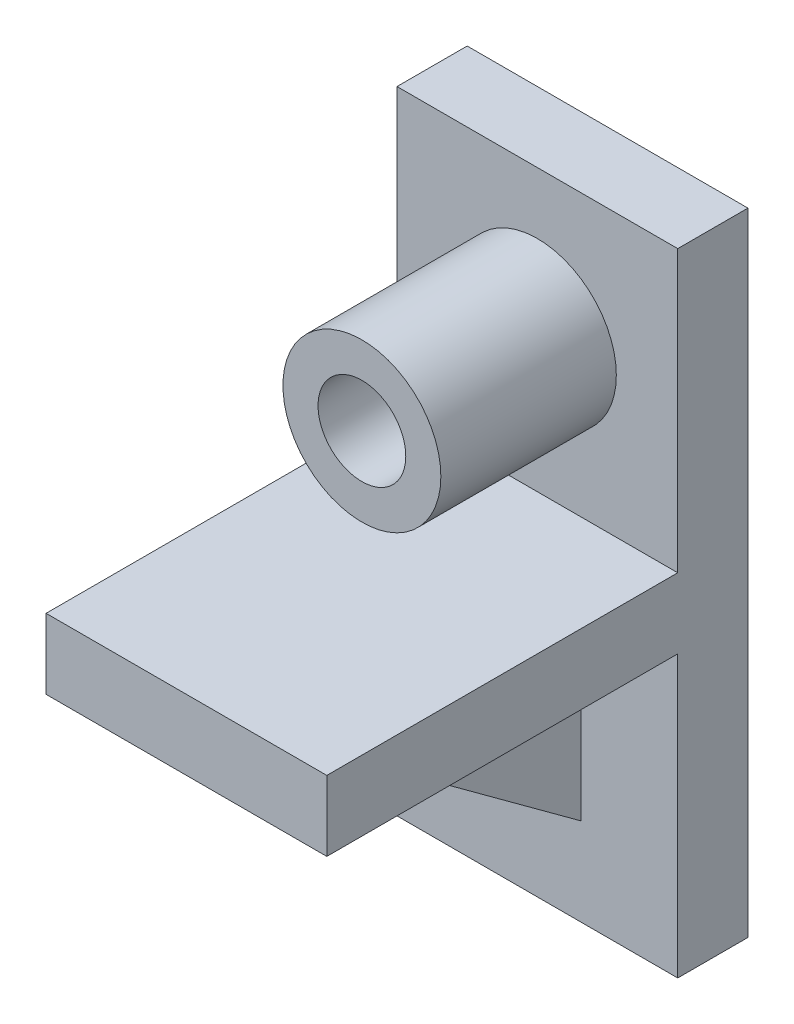
ISO-10303-21;
HEADER;
FILE_DESCRIPTION(('STEP AP214'),'2;1');
FILE_NAME('part.step','',(''),(''),'','','');
FILE_SCHEMA(('AUTOMOTIVE_DESIGN { 1 0 10303 214 1 1 1 1 }'));
ENDSEC;
DATA;
#1=APPLICATION_CONTEXT('core data for automotive mechanical design processes');
#2=APPLICATION_PROTOCOL_DEFINITION('international standard','automotive_design',2000,#1);
#3=PRODUCT_CONTEXT('',#1,'mechanical');
#4=PRODUCT('Part','Part','',(#3));
#5=PRODUCT_RELATED_PRODUCT_CATEGORY('part','',(#4));
#6=PRODUCT_DEFINITION_FORMATION('','',#4);
#7=PRODUCT_DEFINITION_CONTEXT('part definition',#1,'design');
#8=PRODUCT_DEFINITION('design','',#6,#7);
#9=PRODUCT_DEFINITION_SHAPE('','',#8);
#10=(LENGTH_UNIT() NAMED_UNIT(*) SI_UNIT(.MILLI.,.METRE.));
#11=(NAMED_UNIT(*) PLANE_ANGLE_UNIT() SI_UNIT($,.RADIAN.));
#12=(NAMED_UNIT(*) SI_UNIT($,.STERADIAN.) SOLID_ANGLE_UNIT());
#13=UNCERTAINTY_MEASURE_WITH_UNIT(LENGTH_MEASURE(1.E-05),#10,'distance_accuracy_value','');
#14=(GEOMETRIC_REPRESENTATION_CONTEXT(3) GLOBAL_UNCERTAINTY_ASSIGNED_CONTEXT((#13)) GLOBAL_UNIT_ASSIGNED_CONTEXT((#10,
#11,#12)) REPRESENTATION_CONTEXT('',''));
#15=CARTESIAN_POINT('',(0.,0.,0.));
#16=DIRECTION('',(0.,0.,1.));
#17=DIRECTION('',(1.,0.,0.));
#18=AXIS2_PLACEMENT_3D('',#15,#16,#17);
#19=CARTESIAN_POINT('',(0.,0.,8.));
#20=DIRECTION('',(0.,0.,1.));
#21=DIRECTION('',(1.,0.,0.));
#22=AXIS2_PLACEMENT_3D('',#19,#20,#21);
#23=PLANE('',#22);
#24=CARTESIAN_POINT('',(-4.75313807531379,-3.48117154811716,8.));
#25=DIRECTION('',(0.,0.,1.));
#26=DIRECTION('',(1.,0.,0.));
#27=AXIS2_PLACEMENT_3D('',#24,#25,#26);
#28=CIRCLE('',#27,9.);
#29=CARTESIAN_POINT('',(4.24686192468621,-3.48117154811716,8.));
#30=VERTEX_POINT('',#29);
#31=EDGE_CURVE('E202',#30,#30,#28,.T.);
#32=ORIENTED_EDGE('',*,*,#31,.F.);
#33=EDGE_LOOP('',(#32));
#34=FACE_BOUND('',#33,.T.);
#35=DIRECTION('',(-1.,0.,0.));
#36=VECTOR('',#35,1.);
#37=CARTESIAN_POINT('',(-20.7531380753138,12.5188284518828,8.));
#38=LINE('',#37,#36);
#39=CARTESIAN_POINT('',(11.2468619246862,12.5188284518828,8.));
#40=VERTEX_POINT('',#39);
#41=CARTESIAN_POINT('',(-20.7531380753138,12.5188284518828,8.));
#42=VERTEX_POINT('',#41);
#43=EDGE_CURVE('E226',#40,#42,#38,.T.);
#44=ORIENTED_EDGE('',*,*,#43,.T.);
#45=DIRECTION('',(0.,-1.,0.));
#46=VECTOR('',#45,1.);
#47=CARTESIAN_POINT('',(-20.7531380753138,12.5188284518828,8.));
#48=LINE('',#47,#46);
#49=CARTESIAN_POINT('',(-20.7531380753138,-19.4811715481171,8.));
#50=VERTEX_POINT('',#49);
#51=EDGE_CURVE('E213',#42,#50,#48,.T.);
#52=ORIENTED_EDGE('',*,*,#51,.T.);
#53=DIRECTION('',(-1.,0.,0.));
#54=VECTOR('',#53,1.);
#55=CARTESIAN_POINT('',(11.2468619246862,-19.4811715481171,8.));
#56=LINE('',#55,#54);
#57=CARTESIAN_POINT('',(11.2468619246862,-19.4811715481171,8.));
#58=VERTEX_POINT('',#57);
#59=EDGE_CURVE('E181',#58,#50,#56,.T.);
#60=ORIENTED_EDGE('',*,*,#59,.F.);
#61=DIRECTION('',(0.,1.,0.));
#62=VECTOR('',#61,1.);
#63=CARTESIAN_POINT('',(11.2468619246862,12.5188284518828,8.));
#64=LINE('',#63,#62);
#65=EDGE_CURVE('E221',#58,#40,#64,.T.);
#66=ORIENTED_EDGE('',*,*,#65,.T.);
#67=EDGE_LOOP('',(#44,#52,#60,#66));
#68=FACE_BOUND('',#67,.T.);
#69=ADVANCED_FACE('F45',(#34,#68),#23,.T.);
#70=DIRECTION('',(0.,-1.,0.));
#71=VECTOR('',#70,1.);
#72=CARTESIAN_POINT('',(-9.7531380753138,0.,8.));
#73=LINE('',#72,#71);
#74=CARTESIAN_POINT('',(-9.7531380753138,-27.4811715481171,8.));
#75=VERTEX_POINT('',#74);
#76=CARTESIAN_POINT('',(-9.7531380753138,-49.4811715481171,8.));
#77=VERTEX_POINT('',#76);
#78=EDGE_CURVE('E139',#75,#77,#73,.T.);
#79=ORIENTED_EDGE('',*,*,#78,.F.);
#80=DIRECTION('',(1.,0.,0.));
#81=VECTOR('',#80,1.);
#82=CARTESIAN_POINT('',(-20.7531380753138,-27.4811715481171,8.));
#83=LINE('',#82,#81);
#84=CARTESIAN_POINT('',(-20.7531380753138,-27.4811715481171,8.));
#85=VERTEX_POINT('',#84);
#86=EDGE_CURVE('E178',#85,#75,#83,.T.);
#87=ORIENTED_EDGE('',*,*,#86,.F.);
#88=CARTESIAN_POINT('',(-20.7531380753138,-59.4811715481171,8.));
#89=VERTEX_POINT('',#88);
#90=EDGE_CURVE('E218',#85,#89,#48,.T.);
#91=ORIENTED_EDGE('',*,*,#90,.T.);
#92=DIRECTION('',(1.,0.,0.));
#93=VECTOR('',#92,1.);
#94=CARTESIAN_POINT('',(-20.7531380753138,-59.4811715481171,8.));
#95=LINE('',#94,#93);
#96=CARTESIAN_POINT('',(11.2468619246862,-59.4811715481171,8.));
#97=VERTEX_POINT('',#96);
#98=EDGE_CURVE('E217',#89,#97,#95,.T.);
#99=ORIENTED_EDGE('',*,*,#98,.T.);
#100=CARTESIAN_POINT('',(11.2468619246862,-27.4811715481171,8.));
#101=VERTEX_POINT('',#100);
#102=EDGE_CURVE('E222',#97,#101,#64,.T.);
#103=ORIENTED_EDGE('',*,*,#102,.T.);
#104=CARTESIAN_POINT('',(0.2468619246862,-27.4811715481171,8.));
#105=VERTEX_POINT('',#104);
#106=EDGE_CURVE('E182',#105,#101,#83,.T.);
#107=ORIENTED_EDGE('',*,*,#106,.F.);
#108=DIRECTION('',(0.,-1.,0.));
#109=VECTOR('',#108,1.);
#110=CARTESIAN_POINT('',(0.246861924686198,0.,8.));
#111=LINE('',#110,#109);
#112=CARTESIAN_POINT('',(0.246861924686204,-49.4811715481171,8.));
#113=VERTEX_POINT('',#112);
#114=EDGE_CURVE('E66',#105,#113,#111,.T.);
#115=ORIENTED_EDGE('',*,*,#114,.T.);
#116=DIRECTION('',(-1.,0.,0.));
#117=VECTOR('',#116,1.);
#118=CARTESIAN_POINT('',(0.,-49.4811715481171,8.));
#119=LINE('',#118,#117);
#120=EDGE_CURVE('E61',#77,#113,#119,.F.);
#121=ORIENTED_EDGE('',*,*,#120,.F.);
#122=EDGE_LOOP('',(#79,#87,#91,#99,#103,#107,#115,#121));
#123=FACE_BOUND('',#122,.T.);
#124=ADVANCED_FACE('F281',(#123),#23,.T.);
#125=CARTESIAN_POINT('',(-20.7531380753138,12.5188284518828,8.));
#126=DIRECTION('',(1.,0.,0.));
#127=DIRECTION('',(0.,1.,0.));
#128=AXIS2_PLACEMENT_3D('',#125,#126,#127);
#129=PLANE('',#128);
#130=DIRECTION('',(0.,-1.,0.));
#131=VECTOR('',#130,1.);
#132=CARTESIAN_POINT('',(-20.7531380753138,12.5188284518828,0.));
#133=LINE('',#132,#131);
#134=CARTESIAN_POINT('',(-20.7531380753138,12.5188284518828,0.));
#135=VERTEX_POINT('',#134);
#136=CARTESIAN_POINT('',(-20.7531380753138,-59.4811715481171,0.));
#137=VERTEX_POINT('',#136);
#138=EDGE_CURVE('E201',#135,#137,#133,.T.);
#139=ORIENTED_EDGE('',*,*,#138,.T.);
#140=DIRECTION('',(0.,0.,-1.));
#141=VECTOR('',#140,1.);
#142=CARTESIAN_POINT('',(-20.7531380753138,-59.4811715481171,8.));
#143=LINE('',#142,#141);
#144=EDGE_CURVE('E54',#89,#137,#143,.T.);
#145=ORIENTED_EDGE('',*,*,#144,.F.);
#146=ORIENTED_EDGE('',*,*,#90,.F.);
#147=DIRECTION('',(0.,0.,-1.));
#148=VECTOR('',#147,1.);
#149=CARTESIAN_POINT('',(-20.7531380753138,-27.4811715481171,28.));
#150=LINE('',#149,#148);
#151=CARTESIAN_POINT('',(-20.7531380753138,-27.4811715481171,48.));
#152=VERTEX_POINT('',#151);
#153=EDGE_CURVE('E197',#152,#85,#150,.T.);
#154=ORIENTED_EDGE('',*,*,#153,.F.);
#155=DIRECTION('',(0.,-1.,0.));
#156=VECTOR('',#155,1.);
#157=CARTESIAN_POINT('',(-20.7531380753138,-19.4811715481171,48.));
#158=LINE('',#157,#156);
#159=CARTESIAN_POINT('',(-20.7531380753138,-19.4811715481171,48.));
#160=VERTEX_POINT('',#159);
#161=EDGE_CURVE('E162',#160,#152,#158,.T.);
#162=ORIENTED_EDGE('',*,*,#161,.F.);
#163=DIRECTION('',(0.,0.,-1.));
#164=VECTOR('',#163,1.);
#165=CARTESIAN_POINT('',(-20.7531380753138,-19.4811715481171,28.));
#166=LINE('',#165,#164);
#167=EDGE_CURVE('E185',#160,#50,#166,.T.);
#168=ORIENTED_EDGE('',*,*,#167,.T.);
#169=ORIENTED_EDGE('',*,*,#51,.F.);
#170=DIRECTION('',(0.,0.,-1.));
#171=VECTOR('',#170,1.);
#172=CARTESIAN_POINT('',(-20.7531380753138,12.5188284518828,8.));
#173=LINE('',#172,#171);
#174=EDGE_CURVE('E229',#42,#135,#173,.T.);
#175=ORIENTED_EDGE('',*,*,#174,.T.);
#176=EDGE_LOOP('',(#139,#145,#146,#154,#162,#168,#169,#175));
#177=FACE_BOUND('',#176,.T.);
#178=ADVANCED_FACE('F47',(#177),#129,.F.);
#179=CARTESIAN_POINT('',(-20.7531380753138,-59.4811715481171,8.));
#180=DIRECTION('',(0.,1.,0.));
#181=DIRECTION('',(0.,0.,1.));
#182=AXIS2_PLACEMENT_3D('',#179,#180,#181);
#183=PLANE('',#182);
#184=DIRECTION('',(1.,0.,0.));
#185=VECTOR('',#184,1.);
#186=CARTESIAN_POINT('',(-20.7531380753138,-59.4811715481171,0.));
#187=LINE('',#186,#185);
#188=CARTESIAN_POINT('',(11.2468619246862,-59.4811715481171,0.));
#189=VERTEX_POINT('',#188);
#190=EDGE_CURVE('E233',#137,#189,#187,.T.);
#191=ORIENTED_EDGE('',*,*,#190,.T.);
#192=DIRECTION('',(0.,0.,-1.));
#193=VECTOR('',#192,1.);
#194=CARTESIAN_POINT('',(11.2468619246862,-59.4811715481171,8.));
#195=LINE('',#194,#193);
#196=EDGE_CURVE('E249',#97,#189,#195,.T.);
#197=ORIENTED_EDGE('',*,*,#196,.F.);
#198=ORIENTED_EDGE('',*,*,#98,.F.);
#199=ORIENTED_EDGE('',*,*,#144,.T.);
#200=EDGE_LOOP('',(#191,#197,#198,#199));
#201=FACE_BOUND('',#200,.T.);
#202=ADVANCED_FACE('F257',(#201),#183,.F.);
#203=CARTESIAN_POINT('',(11.2468619246862,12.5188284518828,8.));
#204=DIRECTION('',(-1.,0.,0.));
#205=DIRECTION('',(0.,-1.,0.));
#206=AXIS2_PLACEMENT_3D('',#203,#204,#205);
#207=PLANE('',#206);
#208=DIRECTION('',(0.,1.,0.));
#209=VECTOR('',#208,1.);
#210=CARTESIAN_POINT('',(11.2468619246862,12.5188284518828,0.));
#211=LINE('',#210,#209);
#212=CARTESIAN_POINT('',(11.2468619246862,12.5188284518828,0.));
#213=VERTEX_POINT('',#212);
#214=EDGE_CURVE('E236',#189,#213,#211,.T.);
#215=ORIENTED_EDGE('',*,*,#214,.T.);
#216=DIRECTION('',(0.,0.,-1.));
#217=VECTOR('',#216,1.);
#218=CARTESIAN_POINT('',(11.2468619246862,12.5188284518828,8.));
#219=LINE('',#218,#217);
#220=EDGE_CURVE('E245',#40,#213,#219,.T.);
#221=ORIENTED_EDGE('',*,*,#220,.F.);
#222=ORIENTED_EDGE('',*,*,#65,.F.);
#223=DIRECTION('',(0.,0.,-1.));
#224=VECTOR('',#223,1.);
#225=CARTESIAN_POINT('',(11.2468619246862,-19.4811715481171,28.));
#226=LINE('',#225,#224);
#227=CARTESIAN_POINT('',(11.2468619246862,-19.4811715481171,48.));
#228=VERTEX_POINT('',#227);
#229=EDGE_CURVE('E189',#228,#58,#226,.T.);
#230=ORIENTED_EDGE('',*,*,#229,.F.);
#231=DIRECTION('',(0.,1.,0.));
#232=VECTOR('',#231,1.);
#233=CARTESIAN_POINT('',(11.2468619246862,-19.4811715481171,48.));
#234=LINE('',#233,#232);
#235=CARTESIAN_POINT('',(11.2468619246862,-27.4811715481171,48.));
#236=VERTEX_POINT('',#235);
#237=EDGE_CURVE('E170',#236,#228,#234,.T.);
#238=ORIENTED_EDGE('',*,*,#237,.F.);
#239=DIRECTION('',(0.,0.,-1.));
#240=VECTOR('',#239,1.);
#241=CARTESIAN_POINT('',(11.2468619246862,-27.4811715481171,28.));
#242=LINE('',#241,#240);
#243=EDGE_CURVE('E193',#236,#101,#242,.T.);
#244=ORIENTED_EDGE('',*,*,#243,.T.);
#245=ORIENTED_EDGE('',*,*,#102,.F.);
#246=ORIENTED_EDGE('',*,*,#196,.T.);
#247=EDGE_LOOP('',(#215,#221,#222,#230,#238,#244,#245,#246));
#248=FACE_BOUND('',#247,.T.);
#249=ADVANCED_FACE('F270',(#248),#207,.F.);
#250=CARTESIAN_POINT('',(-20.7531380753138,12.5188284518828,8.));
#251=DIRECTION('',(0.,-1.,0.));
#252=DIRECTION('',(0.,0.,-1.));
#253=AXIS2_PLACEMENT_3D('',#250,#251,#252);
#254=PLANE('',#253);
#255=ORIENTED_EDGE('',*,*,#174,.F.);
#256=ORIENTED_EDGE('',*,*,#43,.F.);
#257=ORIENTED_EDGE('',*,*,#220,.T.);
#258=DIRECTION('',(-1.,0.,0.));
#259=VECTOR('',#258,1.);
#260=CARTESIAN_POINT('',(-20.7531380753138,12.5188284518828,0.));
#261=LINE('',#260,#259);
#262=EDGE_CURVE('E239',#213,#135,#261,.T.);
#263=ORIENTED_EDGE('',*,*,#262,.T.);
#264=EDGE_LOOP('',(#255,#256,#257,#263));
#265=FACE_BOUND('',#264,.T.);
#266=ADVANCED_FACE('F275',(#265),#254,.F.);
#267=CARTESIAN_POINT('',(0.,0.,0.));
#268=DIRECTION('',(0.,0.,1.));
#269=DIRECTION('',(1.,0.,0.));
#270=AXIS2_PLACEMENT_3D('',#267,#268,#269);
#271=PLANE('',#270);
#272=ORIENTED_EDGE('',*,*,#138,.F.);
#273=ORIENTED_EDGE('',*,*,#262,.F.);
#274=ORIENTED_EDGE('',*,*,#214,.F.);
#275=ORIENTED_EDGE('',*,*,#190,.F.);
#276=EDGE_LOOP('',(#272,#273,#274,#275));
#277=FACE_BOUND('',#276,.T.);
#278=ADVANCED_FACE('F266',(#277),#271,.F.);
#279=CARTESIAN_POINT('',(-4.75313807531379,-3.48117154811716,28.));
#280=DIRECTION('',(0.,0.,1.));
#281=DIRECTION('',(1.,0.,0.));
#282=AXIS2_PLACEMENT_3D('',#279,#280,#281);
#283=PLANE('',#282);
#284=CARTESIAN_POINT('',(-4.75313807531379,-3.48117154811716,28.));
#285=DIRECTION('',(0.,0.,1.));
#286=DIRECTION('',(1.,0.,0.));
#287=AXIS2_PLACEMENT_3D('',#284,#285,#286);
#288=CIRCLE('',#287,5.);
#289=CARTESIAN_POINT('',(0.246861924686205,-3.48117154811716,28.));
#290=VERTEX_POINT('',#289);
#291=EDGE_CURVE('E206',#290,#290,#288,.T.);
#292=ORIENTED_EDGE('',*,*,#291,.F.);
#293=EDGE_LOOP('',(#292));
#294=FACE_BOUND('',#293,.T.);
#295=CARTESIAN_POINT('',(-4.75313807531379,-3.48117154811716,28.));
#296=DIRECTION('',(0.,0.,1.));
#297=DIRECTION('',(1.,0.,0.));
#298=AXIS2_PLACEMENT_3D('',#295,#296,#297);
#299=CIRCLE('',#298,9.);
#300=CARTESIAN_POINT('',(4.24686192468621,-3.48117154811716,28.));
#301=VERTEX_POINT('',#300);
#302=EDGE_CURVE('E177',#301,#301,#299,.T.);
#303=ORIENTED_EDGE('',*,*,#302,.T.);
#304=EDGE_LOOP('',(#303));
#305=FACE_BOUND('',#304,.T.);
#306=ADVANCED_FACE('F325',(#294,#305),#283,.T.);
#307=CARTESIAN_POINT('',(-4.75313807531379,-3.48117154811716,28.));
#308=DIRECTION('',(0.,0.,-1.));
#309=DIRECTION('',(-1.,0.,0.));
#310=AXIS2_PLACEMENT_3D('',#307,#308,#309);
#311=CYLINDRICAL_SURFACE('',#310,9.);
#312=ORIENTED_EDGE('',*,*,#31,.T.);
#313=EDGE_LOOP('',(#312));
#314=FACE_BOUND('',#313,.T.);
#315=ORIENTED_EDGE('',*,*,#302,.F.);
#316=EDGE_LOOP('',(#315));
#317=FACE_BOUND('',#316,.T.);
#318=ADVANCED_FACE('F319',(#314,#317),#311,.T.);
#319=CARTESIAN_POINT('',(-4.75313807531379,-3.48117154811716,28.));
#320=DIRECTION('',(0.,0.,-1.));
#321=DIRECTION('',(-1.,0.,0.));
#322=AXIS2_PLACEMENT_3D('',#319,#320,#321);
#323=CYLINDRICAL_SURFACE('',#322,5.);
#324=CARTESIAN_POINT('',(-4.75313807531379,-3.48117154811716,8.));
#325=DIRECTION('',(0.,0.,1.));
#326=DIRECTION('',(1.,0.,0.));
#327=AXIS2_PLACEMENT_3D('',#324,#325,#326);
#328=CIRCLE('',#327,5.);
#329=CARTESIAN_POINT('',(0.246861924686205,-3.48117154811716,8.));
#330=VERTEX_POINT('',#329);
#331=EDGE_CURVE('E11',#330,#330,#328,.F.);
#332=ORIENTED_EDGE('',*,*,#331,.T.);
#333=EDGE_LOOP('',(#332));
#334=FACE_BOUND('',#333,.T.);
#335=ORIENTED_EDGE('',*,*,#291,.T.);
#336=EDGE_LOOP('',(#335));
#337=FACE_BOUND('',#336,.T.);
#338=ADVANCED_FACE('F312',(#334,#337),#323,.F.);
#339=ORIENTED_EDGE('',*,*,#331,.F.);
#340=EDGE_LOOP('',(#339));
#341=FACE_BOUND('',#340,.T.);
#342=ADVANCED_FACE('F303',(#341),#23,.T.);
#343=CARTESIAN_POINT('',(-20.7531380753138,-27.4811715481171,28.));
#344=DIRECTION('',(0.,1.,0.));
#345=DIRECTION('',(0.,0.,1.));
#346=AXIS2_PLACEMENT_3D('',#343,#344,#345);
#347=PLANE('',#346);
#348=ORIENTED_EDGE('',*,*,#86,.T.);
#349=DIRECTION('',(0.,0.,1.));
#350=VECTOR('',#349,1.);
#351=CARTESIAN_POINT('',(-9.7531380753138,-27.4811715481171,28.));
#352=LINE('',#351,#350);
#353=CARTESIAN_POINT('',(-9.7531380753138,-27.4811715481171,38.));
#354=VERTEX_POINT('',#353);
#355=EDGE_CURVE('E133',#75,#354,#352,.T.);
#356=ORIENTED_EDGE('',*,*,#355,.T.);
#357=DIRECTION('',(-1.,0.,0.));
#358=VECTOR('',#357,1.);
#359=CARTESIAN_POINT('',(-20.7531380753138,-27.4811715481171,38.));
#360=LINE('',#359,#358);
#361=CARTESIAN_POINT('',(0.246861924686201,-27.4811715481171,38.));
#362=VERTEX_POINT('',#361);
#363=EDGE_CURVE('E127',#354,#362,#360,.F.);
#364=ORIENTED_EDGE('',*,*,#363,.T.);
#365=DIRECTION('',(0.,0.,1.));
#366=VECTOR('',#365,1.);
#367=CARTESIAN_POINT('',(0.2468619246862,-27.4811715481171,28.));
#368=LINE('',#367,#366);
#369=EDGE_CURVE('E131',#105,#362,#368,.T.);
#370=ORIENTED_EDGE('',*,*,#369,.F.);
#371=ORIENTED_EDGE('',*,*,#106,.T.);
#372=ORIENTED_EDGE('',*,*,#243,.F.);
#373=DIRECTION('',(1.,0.,0.));
#374=VECTOR('',#373,1.);
#375=CARTESIAN_POINT('',(-20.7531380753138,-27.4811715481171,48.));
#376=LINE('',#375,#374);
#377=EDGE_CURVE('E166',#152,#236,#376,.T.);
#378=ORIENTED_EDGE('',*,*,#377,.F.);
#379=ORIENTED_EDGE('',*,*,#153,.T.);
#380=EDGE_LOOP('',(#348,#356,#364,#370,#371,#372,#378,#379));
#381=FACE_BOUND('',#380,.T.);
#382=ADVANCED_FACE('F130',(#381),#347,.F.);
#383=CARTESIAN_POINT('',(11.2468619246862,-19.4811715481171,28.));
#384=DIRECTION('',(0.,-1.,0.));
#385=DIRECTION('',(0.,0.,-1.));
#386=AXIS2_PLACEMENT_3D('',#383,#384,#385);
#387=PLANE('',#386);
#388=ORIENTED_EDGE('',*,*,#167,.F.);
#389=DIRECTION('',(-1.,0.,0.));
#390=VECTOR('',#389,1.);
#391=CARTESIAN_POINT('',(-20.7531380753138,-19.4811715481171,48.));
#392=LINE('',#391,#390);
#393=EDGE_CURVE('E174',#228,#160,#392,.T.);
#394=ORIENTED_EDGE('',*,*,#393,.F.);
#395=ORIENTED_EDGE('',*,*,#229,.T.);
#396=ORIENTED_EDGE('',*,*,#59,.T.);
#397=EDGE_LOOP('',(#388,#394,#395,#396));
#398=FACE_BOUND('',#397,.T.);
#399=ADVANCED_FACE('F288',(#398),#387,.F.);
#400=CARTESIAN_POINT('',(0.,0.,48.));
#401=DIRECTION('',(0.,0.,1.));
#402=DIRECTION('',(1.,0.,0.));
#403=AXIS2_PLACEMENT_3D('',#400,#401,#402);
#404=PLANE('',#403);
#405=ORIENTED_EDGE('',*,*,#393,.T.);
#406=ORIENTED_EDGE('',*,*,#161,.T.);
#407=ORIENTED_EDGE('',*,*,#377,.T.);
#408=ORIENTED_EDGE('',*,*,#237,.T.);
#409=EDGE_LOOP('',(#405,#406,#407,#408));
#410=FACE_BOUND('',#409,.T.);
#411=ADVANCED_FACE('F285',(#410),#404,.T.);
#412=CARTESIAN_POINT('',(-4.7531380753138,-27.4811715481171,38.));
#413=DIRECTION('',(0.,0.806404995855705,-0.591363663627517));
#414=DIRECTION('',(0.,-0.591363663627517,-0.806404995855705));
#415=AXIS2_PLACEMENT_3D('',#412,#413,#414);
#416=PLANE('',#415);
#417=DIRECTION('',(0.,-0.591363663627517,-0.806404995855705));
#418=VECTOR('',#417,1.);
#419=CARTESIAN_POINT('',(-9.7531380753138,-27.4811715481171,38.));
#420=LINE('',#419,#418);
#421=EDGE_CURVE('E146',#354,#77,#420,.T.);
#422=ORIENTED_EDGE('',*,*,#421,.T.);
#423=ORIENTED_EDGE('',*,*,#120,.T.);
#424=DIRECTION('',(0.,-0.591363663627517,-0.806404995855705));
#425=VECTOR('',#424,1.);
#426=CARTESIAN_POINT('',(0.246861924686201,-27.4811715481171,38.));
#427=LINE('',#426,#425);
#428=EDGE_CURVE('E144',#362,#113,#427,.T.);
#429=ORIENTED_EDGE('',*,*,#428,.F.);
#430=ORIENTED_EDGE('',*,*,#363,.F.);
#431=EDGE_LOOP('',(#422,#423,#429,#430));
#432=FACE_BOUND('',#431,.T.);
#433=ADVANCED_FACE('F148',(#432),#416,.F.);
#434=CARTESIAN_POINT('',(-9.7531380753138,-23.4811715481171,24.));
#435=DIRECTION('',(-1.,0.,0.));
#436=DIRECTION('',(0.,-1.,0.));
#437=AXIS2_PLACEMENT_3D('',#434,#435,#436);
#438=PLANE('',#437);
#439=ORIENTED_EDGE('',*,*,#355,.F.);
#440=ORIENTED_EDGE('',*,*,#78,.T.);
#441=ORIENTED_EDGE('',*,*,#421,.F.);
#442=EDGE_LOOP('',(#439,#440,#441));
#443=FACE_BOUND('',#442,.T.);
#444=ADVANCED_FACE('F291',(#443),#438,.T.);
#445=CARTESIAN_POINT('',(0.246861924686201,-23.4811715481171,24.));
#446=DIRECTION('',(-1.,0.,0.));
#447=DIRECTION('',(0.,-1.,0.));
#448=AXIS2_PLACEMENT_3D('',#445,#446,#447);
#449=PLANE('',#448);
#450=ORIENTED_EDGE('',*,*,#114,.F.);
#451=ORIENTED_EDGE('',*,*,#369,.T.);
#452=ORIENTED_EDGE('',*,*,#428,.T.);
#453=EDGE_LOOP('',(#450,#451,#452));
#454=FACE_BOUND('',#453,.T.);
#455=ADVANCED_FACE('F143',(#454),#449,.F.);
#456=CLOSED_SHELL('',(#69,#124,#178,#202,#249,#266,#278,#306,#318,#338,#342,#382,#399,#411,#433,
#444,#455));
#457=MANIFOLD_SOLID_BREP('B2',#456);
#458=ADVANCED_BREP_SHAPE_REPRESENTATION('',(#18,#457),#14);
#459=SHAPE_DEFINITION_REPRESENTATION(#9,#458);
ENDSEC;
END-ISO-10303-21;
